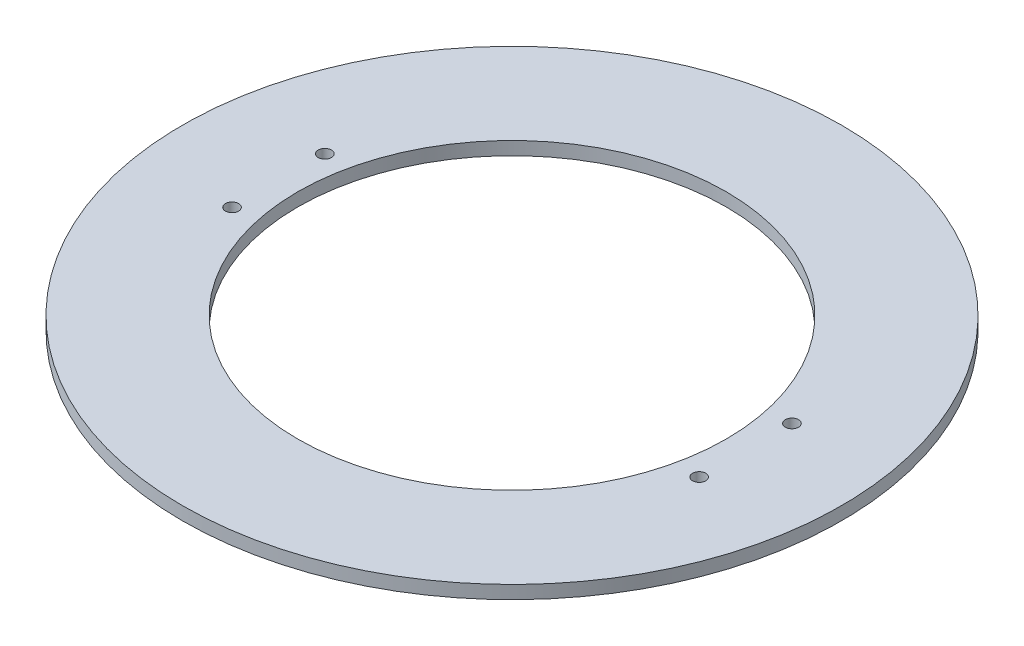
ISO-10303-21;
HEADER;
FILE_DESCRIPTION(('STEP AP214'),'2;1');
FILE_NAME('part.step','',(''),(''),'','','');
FILE_SCHEMA(('AUTOMOTIVE_DESIGN { 1 0 10303 214 1 1 1 1 }'));
ENDSEC;
DATA;
#1=APPLICATION_CONTEXT('core data for automotive mechanical design processes');
#2=APPLICATION_PROTOCOL_DEFINITION('international standard','automotive_design',2000,#1);
#3=PRODUCT_CONTEXT('',#1,'mechanical');
#4=PRODUCT('Part','Part','',(#3));
#5=PRODUCT_RELATED_PRODUCT_CATEGORY('part','',(#4));
#6=PRODUCT_DEFINITION_FORMATION('','',#4);
#7=PRODUCT_DEFINITION_CONTEXT('part definition',#1,'design');
#8=PRODUCT_DEFINITION('design','',#6,#7);
#9=PRODUCT_DEFINITION_SHAPE('','',#8);
#10=(LENGTH_UNIT() NAMED_UNIT(*) SI_UNIT(.MILLI.,.METRE.));
#11=(NAMED_UNIT(*) PLANE_ANGLE_UNIT() SI_UNIT($,.RADIAN.));
#12=(NAMED_UNIT(*) SI_UNIT($,.STERADIAN.) SOLID_ANGLE_UNIT());
#13=UNCERTAINTY_MEASURE_WITH_UNIT(LENGTH_MEASURE(1.E-05),#10,'distance_accuracy_value','');
#14=(GEOMETRIC_REPRESENTATION_CONTEXT(3) GLOBAL_UNCERTAINTY_ASSIGNED_CONTEXT((#13)) GLOBAL_UNIT_ASSIGNED_CONTEXT((#10,
#11,#12)) REPRESENTATION_CONTEXT('',''));
#15=CARTESIAN_POINT('',(0.,0.,0.));
#16=DIRECTION('',(0.,0.,1.));
#17=DIRECTION('',(1.,0.,0.));
#18=AXIS2_PLACEMENT_3D('',#15,#16,#17);
#19=CARTESIAN_POINT('',(0.,4.,0.));
#20=DIRECTION('',(0.,1.,0.));
#21=DIRECTION('',(0.,0.,1.));
#22=AXIS2_PLACEMENT_3D('',#19,#20,#21);
#23=PLANE('',#22);
#24=CARTESIAN_POINT('',(70.87,4.,14.075));
#25=DIRECTION('',(0.,1.,0.));
#26=DIRECTION('',(0.,0.,1.));
#27=AXIS2_PLACEMENT_3D('',#24,#25,#26);
#28=CIRCLE('',#27,2.);
#29=CARTESIAN_POINT('',(70.87,4.,16.075));
#30=VERTEX_POINT('',#29);
#31=EDGE_CURVE('E65',#30,#30,#28,.T.);
#32=ORIENTED_EDGE('',*,*,#31,.F.);
#33=EDGE_LOOP('',(#32));
#34=FACE_BOUND('',#33,.T.);
#35=CARTESIAN_POINT('',(-70.87,4.,-14.075));
#36=DIRECTION('',(0.,1.,0.));
#37=DIRECTION('',(0.,0.,1.));
#38=AXIS2_PLACEMENT_3D('',#35,#36,#37);
#39=CIRCLE('',#38,2.);
#40=CARTESIAN_POINT('',(-70.87,4.,-12.075));
#41=VERTEX_POINT('',#40);
#42=EDGE_CURVE('E53',#41,#41,#39,.T.);
#43=ORIENTED_EDGE('',*,*,#42,.F.);
#44=EDGE_LOOP('',(#43));
#45=FACE_BOUND('',#44,.T.);
#46=CARTESIAN_POINT('',(0.,4.,0.));
#47=DIRECTION('',(0.,1.,0.));
#48=DIRECTION('',(0.,0.,1.));
#49=AXIS2_PLACEMENT_3D('',#46,#47,#48);
#50=CIRCLE('',#49,100.);
#51=CARTESIAN_POINT('',(0.,4.,100.));
#52=VERTEX_POINT('',#51);
#53=EDGE_CURVE('E10',#52,#52,#50,.T.);
#54=ORIENTED_EDGE('',*,*,#53,.T.);
#55=EDGE_LOOP('',(#54));
#56=FACE_BOUND('',#55,.T.);
#57=CARTESIAN_POINT('',(0.,4.,0.));
#58=DIRECTION('',(0.,1.,0.));
#59=DIRECTION('',(0.,0.,1.));
#60=AXIS2_PLACEMENT_3D('',#57,#58,#59);
#61=CIRCLE('',#60,65.);
#62=CARTESIAN_POINT('',(0.,4.,65.));
#63=VERTEX_POINT('',#62);
#64=EDGE_CURVE('E48',#63,#63,#61,.T.);
#65=ORIENTED_EDGE('',*,*,#64,.F.);
#66=EDGE_LOOP('',(#65));
#67=FACE_BOUND('',#66,.T.);
#68=CARTESIAN_POINT('',(-70.87,4.,14.075));
#69=DIRECTION('',(0.,1.,0.));
#70=DIRECTION('',(0.,0.,-1.));
#71=AXIS2_PLACEMENT_3D('',#68,#69,#70);
#72=CIRCLE('',#71,2.);
#73=CARTESIAN_POINT('',(-70.87,4.,12.075));
#74=VERTEX_POINT('',#73);
#75=EDGE_CURVE('E59',#74,#74,#72,.T.);
#76=ORIENTED_EDGE('',*,*,#75,.F.);
#77=EDGE_LOOP('',(#76));
#78=FACE_BOUND('',#77,.T.);
#79=CARTESIAN_POINT('',(70.87,4.,-14.075));
#80=DIRECTION('',(0.,1.,0.));
#81=DIRECTION('',(0.,0.,-1.));
#82=AXIS2_PLACEMENT_3D('',#79,#80,#81);
#83=CIRCLE('',#82,2.);
#84=CARTESIAN_POINT('',(70.87,4.,-16.075));
#85=VERTEX_POINT('',#84);
#86=EDGE_CURVE('E71',#85,#85,#83,.T.);
#87=ORIENTED_EDGE('',*,*,#86,.F.);
#88=EDGE_LOOP('',(#87));
#89=FACE_BOUND('',#88,.T.);
#90=ADVANCED_FACE('F37',(#34,#45,#56,#67,#78,#89),#23,.T.);
#91=CARTESIAN_POINT('',(0.,0.,0.));
#92=DIRECTION('',(0.,1.,0.));
#93=DIRECTION('',(0.,0.,1.));
#94=AXIS2_PLACEMENT_3D('',#91,#92,#93);
#95=PLANE('',#94);
#96=CARTESIAN_POINT('',(0.,0.,0.));
#97=DIRECTION('',(0.,1.,0.));
#98=DIRECTION('',(0.,0.,1.));
#99=AXIS2_PLACEMENT_3D('',#96,#97,#98);
#100=CIRCLE('',#99,100.);
#101=CARTESIAN_POINT('',(0.,0.,100.));
#102=VERTEX_POINT('',#101);
#103=EDGE_CURVE('E41',#102,#102,#100,.T.);
#104=ORIENTED_EDGE('',*,*,#103,.F.);
#105=EDGE_LOOP('',(#104));
#106=FACE_BOUND('',#105,.T.);
#107=CARTESIAN_POINT('',(0.,0.,0.));
#108=DIRECTION('',(0.,1.,0.));
#109=DIRECTION('',(0.,0.,1.));
#110=AXIS2_PLACEMENT_3D('',#107,#108,#109);
#111=CIRCLE('',#110,65.);
#112=CARTESIAN_POINT('',(0.,0.,65.));
#113=VERTEX_POINT('',#112);
#114=EDGE_CURVE('E50',#113,#113,#111,.T.);
#115=ORIENTED_EDGE('',*,*,#114,.T.);
#116=EDGE_LOOP('',(#115));
#117=FACE_BOUND('',#116,.T.);
#118=CARTESIAN_POINT('',(-70.87,0.,-14.075));
#119=DIRECTION('',(0.,1.,0.));
#120=DIRECTION('',(0.,0.,1.));
#121=AXIS2_PLACEMENT_3D('',#118,#119,#120);
#122=CIRCLE('',#121,2.);
#123=CARTESIAN_POINT('',(-70.87,0.,-12.075));
#124=VERTEX_POINT('',#123);
#125=EDGE_CURVE('E56',#124,#124,#122,.T.);
#126=ORIENTED_EDGE('',*,*,#125,.T.);
#127=EDGE_LOOP('',(#126));
#128=FACE_BOUND('',#127,.T.);
#129=CARTESIAN_POINT('',(-70.87,0.,14.075));
#130=DIRECTION('',(0.,1.,0.));
#131=DIRECTION('',(0.,0.,-1.));
#132=AXIS2_PLACEMENT_3D('',#129,#130,#131);
#133=CIRCLE('',#132,2.);
#134=CARTESIAN_POINT('',(-70.87,0.,12.075));
#135=VERTEX_POINT('',#134);
#136=EDGE_CURVE('E62',#135,#135,#133,.T.);
#137=ORIENTED_EDGE('',*,*,#136,.T.);
#138=EDGE_LOOP('',(#137));
#139=FACE_BOUND('',#138,.T.);
#140=CARTESIAN_POINT('',(70.87,0.,14.075));
#141=DIRECTION('',(0.,1.,0.));
#142=DIRECTION('',(0.,0.,1.));
#143=AXIS2_PLACEMENT_3D('',#140,#141,#142);
#144=CIRCLE('',#143,2.);
#145=CARTESIAN_POINT('',(70.87,0.,16.075));
#146=VERTEX_POINT('',#145);
#147=EDGE_CURVE('E68',#146,#146,#144,.T.);
#148=ORIENTED_EDGE('',*,*,#147,.T.);
#149=EDGE_LOOP('',(#148));
#150=FACE_BOUND('',#149,.T.);
#151=CARTESIAN_POINT('',(70.87,0.,-14.075));
#152=DIRECTION('',(0.,1.,0.));
#153=DIRECTION('',(0.,0.,-1.));
#154=AXIS2_PLACEMENT_3D('',#151,#152,#153);
#155=CIRCLE('',#154,2.);
#156=CARTESIAN_POINT('',(70.87,0.,-16.075));
#157=VERTEX_POINT('',#156);
#158=EDGE_CURVE('E74',#157,#157,#155,.T.);
#159=ORIENTED_EDGE('',*,*,#158,.T.);
#160=EDGE_LOOP('',(#159));
#161=FACE_BOUND('',#160,.T.);
#162=ADVANCED_FACE('F84',(#106,#117,#128,#139,#150,#161),#95,.F.);
#163=CARTESIAN_POINT('',(0.,4.,0.));
#164=DIRECTION('',(0.,-1.,0.));
#165=DIRECTION('',(0.,0.,-1.));
#166=AXIS2_PLACEMENT_3D('',#163,#164,#165);
#167=CYLINDRICAL_SURFACE('',#166,100.);
#168=ORIENTED_EDGE('',*,*,#53,.F.);
#169=EDGE_LOOP('',(#168));
#170=FACE_BOUND('',#169,.T.);
#171=ORIENTED_EDGE('',*,*,#103,.T.);
#172=EDGE_LOOP('',(#171));
#173=FACE_BOUND('',#172,.T.);
#174=ADVANCED_FACE('F39',(#170,#173),#167,.T.);
#175=CARTESIAN_POINT('',(0.,4.,0.));
#176=DIRECTION('',(0.,-1.,0.));
#177=DIRECTION('',(0.,0.,-1.));
#178=AXIS2_PLACEMENT_3D('',#175,#176,#177);
#179=CYLINDRICAL_SURFACE('',#178,65.);
#180=ORIENTED_EDGE('',*,*,#64,.T.);
#181=EDGE_LOOP('',(#180));
#182=FACE_BOUND('',#181,.T.);
#183=ORIENTED_EDGE('',*,*,#114,.F.);
#184=EDGE_LOOP('',(#183));
#185=FACE_BOUND('',#184,.T.);
#186=ADVANCED_FACE('F94',(#182,#185),#179,.F.);
#187=CARTESIAN_POINT('',(-70.87,4.,-14.075));
#188=DIRECTION('',(0.,-1.,0.));
#189=DIRECTION('',(0.,0.,-1.));
#190=AXIS2_PLACEMENT_3D('',#187,#188,#189);
#191=CYLINDRICAL_SURFACE('',#190,2.);
#192=ORIENTED_EDGE('',*,*,#42,.T.);
#193=EDGE_LOOP('',(#192));
#194=FACE_BOUND('',#193,.T.);
#195=ORIENTED_EDGE('',*,*,#125,.F.);
#196=EDGE_LOOP('',(#195));
#197=FACE_BOUND('',#196,.T.);
#198=ADVANCED_FACE('F97',(#194,#197),#191,.F.);
#199=CARTESIAN_POINT('',(-70.87,4.,14.075));
#200=DIRECTION('',(0.,-1.,0.));
#201=DIRECTION('',(0.,0.,-1.));
#202=AXIS2_PLACEMENT_3D('',#199,#200,#201);
#203=CYLINDRICAL_SURFACE('',#202,2.);
#204=ORIENTED_EDGE('',*,*,#75,.T.);
#205=EDGE_LOOP('',(#204));
#206=FACE_BOUND('',#205,.T.);
#207=ORIENTED_EDGE('',*,*,#136,.F.);
#208=EDGE_LOOP('',(#207));
#209=FACE_BOUND('',#208,.T.);
#210=ADVANCED_FACE('F101',(#206,#209),#203,.F.);
#211=CARTESIAN_POINT('',(70.87,4.,14.075));
#212=DIRECTION('',(0.,-1.,0.));
#213=DIRECTION('',(0.,0.,-1.));
#214=AXIS2_PLACEMENT_3D('',#211,#212,#213);
#215=CYLINDRICAL_SURFACE('',#214,2.);
#216=ORIENTED_EDGE('',*,*,#31,.T.);
#217=EDGE_LOOP('',(#216));
#218=FACE_BOUND('',#217,.T.);
#219=ORIENTED_EDGE('',*,*,#147,.F.);
#220=EDGE_LOOP('',(#219));
#221=FACE_BOUND('',#220,.T.);
#222=ADVANCED_FACE('F105',(#218,#221),#215,.F.);
#223=CARTESIAN_POINT('',(70.87,4.,-14.075));
#224=DIRECTION('',(0.,-1.,0.));
#225=DIRECTION('',(0.,0.,-1.));
#226=AXIS2_PLACEMENT_3D('',#223,#224,#225);
#227=CYLINDRICAL_SURFACE('',#226,2.);
#228=ORIENTED_EDGE('',*,*,#86,.T.);
#229=EDGE_LOOP('',(#228));
#230=FACE_BOUND('',#229,.T.);
#231=ORIENTED_EDGE('',*,*,#158,.F.);
#232=EDGE_LOOP('',(#231));
#233=FACE_BOUND('',#232,.T.);
#234=ADVANCED_FACE('F80',(#230,#233),#227,.F.);
#235=CLOSED_SHELL('',(#90,#162,#174,#186,#198,#210,#222,#234));
#236=MANIFOLD_SOLID_BREP('B2',#235);
#237=ADVANCED_BREP_SHAPE_REPRESENTATION('',(#18,#236),#14);
#238=SHAPE_DEFINITION_REPRESENTATION(#9,#237);
ENDSEC;
END-ISO-10303-21;
